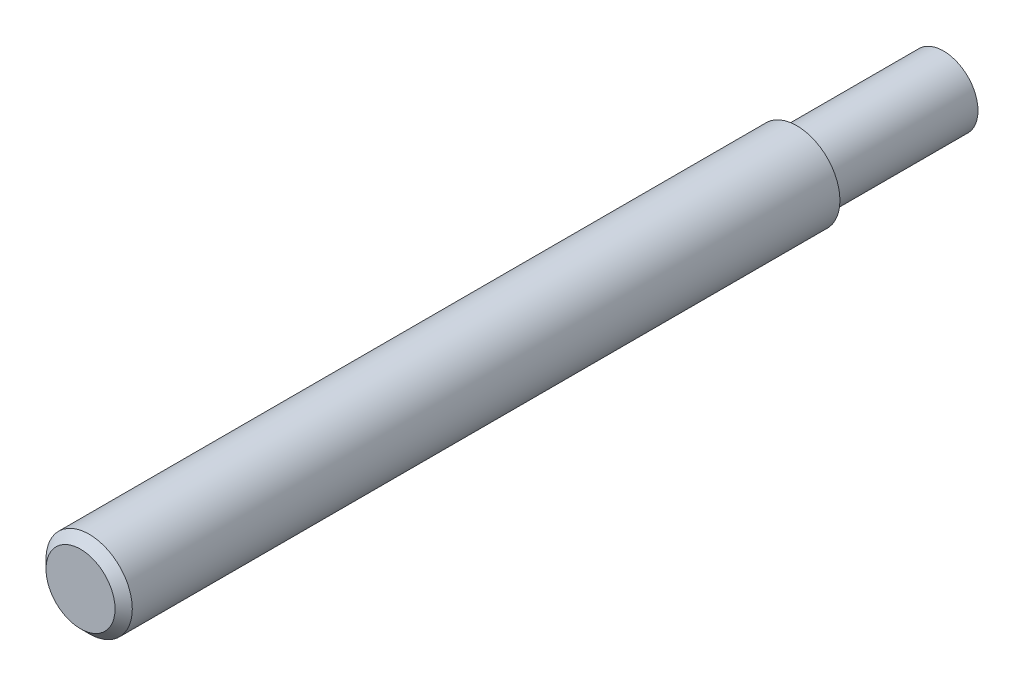
ISO-10303-21;
HEADER;
FILE_DESCRIPTION(('STEP AP214'),'2;1');
FILE_NAME('part.step','',(''),(''),'','','');
FILE_SCHEMA(('AUTOMOTIVE_DESIGN { 1 0 10303 214 1 1 1 1 }'));
ENDSEC;
DATA;
#1=APPLICATION_CONTEXT('core data for automotive mechanical design processes');
#2=APPLICATION_PROTOCOL_DEFINITION('international standard','automotive_design',2000,#1);
#3=PRODUCT_CONTEXT('',#1,'mechanical');
#4=PRODUCT('Part','Part','',(#3));
#5=PRODUCT_RELATED_PRODUCT_CATEGORY('part','',(#4));
#6=PRODUCT_DEFINITION_FORMATION('','',#4);
#7=PRODUCT_DEFINITION_CONTEXT('part definition',#1,'design');
#8=PRODUCT_DEFINITION('design','',#6,#7);
#9=PRODUCT_DEFINITION_SHAPE('','',#8);
#10=(LENGTH_UNIT() NAMED_UNIT(*) SI_UNIT(.MILLI.,.METRE.));
#11=(NAMED_UNIT(*) PLANE_ANGLE_UNIT() SI_UNIT($,.RADIAN.));
#12=(NAMED_UNIT(*) SI_UNIT($,.STERADIAN.) SOLID_ANGLE_UNIT());
#13=UNCERTAINTY_MEASURE_WITH_UNIT(LENGTH_MEASURE(1.E-05),#10,'distance_accuracy_value','');
#14=(GEOMETRIC_REPRESENTATION_CONTEXT(3) GLOBAL_UNCERTAINTY_ASSIGNED_CONTEXT((#13)) GLOBAL_UNIT_ASSIGNED_CONTEXT((#10,
#11,#12)) REPRESENTATION_CONTEXT('',''));
#15=CARTESIAN_POINT('',(0.,0.,0.));
#16=DIRECTION('',(0.,0.,1.));
#17=DIRECTION('',(1.,0.,0.));
#18=AXIS2_PLACEMENT_3D('',#15,#16,#17);
#19=CARTESIAN_POINT('',(0.,0.,17.));
#20=DIRECTION('',(0.,0.,-1.));
#21=DIRECTION('',(-1.,0.,0.));
#22=AXIS2_PLACEMENT_3D('',#19,#20,#21);
#23=CYLINDRICAL_SURFACE('',#22,4.);
#24=CARTESIAN_POINT('',(0.,0.,17.));
#25=DIRECTION('',(0.,0.,1.));
#26=DIRECTION('',(1.,0.,0.));
#27=AXIS2_PLACEMENT_3D('',#24,#25,#26);
#28=CIRCLE('',#27,4.);
#29=CARTESIAN_POINT('',(4.,0.,17.));
#30=VERTEX_POINT('',#29);
#31=EDGE_CURVE('E68',#30,#30,#28,.T.);
#32=ORIENTED_EDGE('',*,*,#31,.F.);
#33=EDGE_LOOP('',(#32));
#34=FACE_BOUND('',#33,.T.);
#35=CARTESIAN_POINT('',(0.,0.,0.));
#36=DIRECTION('',(0.,0.,1.));
#37=DIRECTION('',(1.,0.,0.));
#38=AXIS2_PLACEMENT_3D('',#35,#36,#37);
#39=CIRCLE('',#38,4.);
#40=CARTESIAN_POINT('',(4.,0.,0.));
#41=VERTEX_POINT('',#40);
#42=EDGE_CURVE('E61',#41,#41,#39,.T.);
#43=ORIENTED_EDGE('',*,*,#42,.T.);
#44=EDGE_LOOP('',(#43));
#45=FACE_BOUND('',#44,.T.);
#46=ADVANCED_FACE('F38',(#34,#45),#23,.T.);
#47=CARTESIAN_POINT('',(0.,0.,0.));
#48=DIRECTION('',(0.,0.,1.));
#49=DIRECTION('',(1.,0.,0.));
#50=AXIS2_PLACEMENT_3D('',#47,#48,#49);
#51=PLANE('',#50);
#52=CARTESIAN_POINT('',(0.,0.,0.));
#53=DIRECTION('',(0.,0.,-1.));
#54=DIRECTION('',(-1.,0.,0.));
#55=AXIS2_PLACEMENT_3D('',#52,#53,#54);
#56=CIRCLE('',#55,3.5);
#57=CARTESIAN_POINT('',(-3.5,0.,0.));
#58=VERTEX_POINT('',#57);
#59=EDGE_CURVE('E64',#58,#58,#56,.T.);
#60=ORIENTED_EDGE('',*,*,#59,.F.);
#61=EDGE_LOOP('',(#60));
#62=FACE_BOUND('',#61,.T.);
#63=ORIENTED_EDGE('',*,*,#42,.F.);
#64=EDGE_LOOP('',(#63));
#65=FACE_BOUND('',#64,.T.);
#66=ADVANCED_FACE('F87',(#62,#65),#51,.F.);
#67=CARTESIAN_POINT('',(0.,0.,100.));
#68=DIRECTION('',(0.,0.,-1.));
#69=DIRECTION('',(-1.,0.,0.));
#70=AXIS2_PLACEMENT_3D('',#67,#68,#69);
#71=CYLINDRICAL_SURFACE('',#70,5.);
#72=CARTESIAN_POINT('',(0.,0.,99.));
#73=DIRECTION('',(0.,0.,1.));
#74=DIRECTION('',(1.,0.,0.));
#75=AXIS2_PLACEMENT_3D('',#72,#73,#74);
#76=CIRCLE('',#75,5.);
#77=CARTESIAN_POINT('',(5.,0.,99.));
#78=VERTEX_POINT('',#77);
#79=EDGE_CURVE('E11',#78,#78,#76,.F.);
#80=ORIENTED_EDGE('',*,*,#79,.T.);
#81=EDGE_LOOP('',(#80));
#82=FACE_BOUND('',#81,.T.);
#83=CARTESIAN_POINT('',(0.,0.,17.));
#84=DIRECTION('',(0.,0.,1.));
#85=DIRECTION('',(1.,0.,0.));
#86=AXIS2_PLACEMENT_3D('',#83,#84,#85);
#87=CIRCLE('',#86,5.);
#88=CARTESIAN_POINT('',(5.,0.,17.));
#89=VERTEX_POINT('',#88);
#90=EDGE_CURVE('E57',#89,#89,#87,.T.);
#91=ORIENTED_EDGE('',*,*,#90,.T.);
#92=EDGE_LOOP('',(#91));
#93=FACE_BOUND('',#92,.T.);
#94=ADVANCED_FACE('F92',(#82,#93),#71,.T.);
#95=CARTESIAN_POINT('',(0.,0.,100.));
#96=DIRECTION('',(0.,0.,1.));
#97=DIRECTION('',(1.,0.,0.));
#98=AXIS2_PLACEMENT_3D('',#95,#96,#97);
#99=PLANE('',#98);
#100=CARTESIAN_POINT('',(0.,0.,100.));
#101=DIRECTION('',(0.,0.,1.));
#102=DIRECTION('',(1.,0.,0.));
#103=AXIS2_PLACEMENT_3D('',#100,#101,#102);
#104=CIRCLE('',#103,4.);
#105=CARTESIAN_POINT('',(4.,0.,100.));
#106=VERTEX_POINT('',#105);
#107=EDGE_CURVE('E45',#106,#106,#104,.T.);
#108=ORIENTED_EDGE('',*,*,#107,.T.);
#109=EDGE_LOOP('',(#108));
#110=FACE_BOUND('',#109,.T.);
#111=ADVANCED_FACE('F75',(#110),#99,.T.);
#112=CARTESIAN_POINT('',(0.,0.,17.));
#113=DIRECTION('',(0.,0.,1.));
#114=DIRECTION('',(1.,0.,0.));
#115=AXIS2_PLACEMENT_3D('',#112,#113,#114);
#116=PLANE('',#115);
#117=ORIENTED_EDGE('',*,*,#31,.T.);
#118=EDGE_LOOP('',(#117));
#119=FACE_BOUND('',#118,.T.);
#120=ORIENTED_EDGE('',*,*,#90,.F.);
#121=EDGE_LOOP('',(#120));
#122=FACE_BOUND('',#121,.T.);
#123=ADVANCED_FACE('F78',(#119,#122),#116,.F.);
#124=CARTESIAN_POINT('',(0.,0.,100.));
#125=DIRECTION('',(0.,0.,-1.));
#126=DIRECTION('',(-1.,0.,0.));
#127=AXIS2_PLACEMENT_3D('',#124,#125,#126);
#128=CONICAL_SURFACE('',#127,4.,0.785398163397446);
#129=ORIENTED_EDGE('',*,*,#79,.F.);
#130=EDGE_LOOP('',(#129));
#131=FACE_BOUND('',#130,.T.);
#132=ORIENTED_EDGE('',*,*,#107,.F.);
#133=EDGE_LOOP('',(#132));
#134=FACE_BOUND('',#133,.T.);
#135=ADVANCED_FACE('F40',(#131,#134),#128,.T.);
#136=CARTESIAN_POINT('',(0.,0.,15.));
#137=DIRECTION('',(0.,0.,-1.));
#138=DIRECTION('',(-1.,0.,0.));
#139=AXIS2_PLACEMENT_3D('',#136,#137,#138);
#140=CONICAL_SURFACE('',#139,2.49999999999999,1.02974425867665);
#141=CARTESIAN_POINT('',(0.,0.,16.5021515475689));
#142=VERTEX_POINT('',#141);
#143=VERTEX_LOOP('',#142);
#144=FACE_BOUND('',#143,.T.);
#145=CARTESIAN_POINT('',(0.,0.,15.));
#146=DIRECTION('',(0.,0.,-1.));
#147=DIRECTION('',(-1.,0.,0.));
#148=AXIS2_PLACEMENT_3D('',#145,#146,#147);
#149=CIRCLE('',#148,2.49999999999999);
#150=CARTESIAN_POINT('',(-2.49999999999999,0.,15.));
#151=VERTEX_POINT('',#150);
#152=EDGE_CURVE('E55',#151,#151,#149,.T.);
#153=ORIENTED_EDGE('',*,*,#152,.T.);
#154=EDGE_LOOP('',(#153));
#155=FACE_BOUND('',#154,.T.);
#156=ADVANCED_FACE('F48',(#144,#155),#140,.F.);
#157=CARTESIAN_POINT('',(0.,0.,0.));
#158=DIRECTION('',(0.,0.,-1.));
#159=DIRECTION('',(-1.,0.,0.));
#160=AXIS2_PLACEMENT_3D('',#157,#158,#159);
#161=CYLINDRICAL_SURFACE('',#160,2.49999999999999);
#162=ORIENTED_EDGE('',*,*,#152,.F.);
#163=EDGE_LOOP('',(#162));
#164=FACE_BOUND('',#163,.T.);
#165=CARTESIAN_POINT('',(0.,0.,0.577350269189633));
#166=DIRECTION('',(0.,0.,-1.));
#167=DIRECTION('',(-1.,0.,0.));
#168=AXIS2_PLACEMENT_3D('',#165,#166,#167);
#169=CIRCLE('',#168,2.49999999999999);
#170=CARTESIAN_POINT('',(-2.49999999999999,0.,0.577350269189633));
#171=VERTEX_POINT('',#170);
#172=EDGE_CURVE('E58',#171,#171,#169,.T.);
#173=ORIENTED_EDGE('',*,*,#172,.T.);
#174=EDGE_LOOP('',(#173));
#175=FACE_BOUND('',#174,.T.);
#176=ADVANCED_FACE('F51',(#164,#175),#161,.F.);
#177=CARTESIAN_POINT('',(0.,0.,0.));
#178=DIRECTION('',(0.,0.,-1.));
#179=DIRECTION('',(-1.,0.,0.));
#180=AXIS2_PLACEMENT_3D('',#177,#178,#179);
#181=CONICAL_SURFACE('',#180,3.5,1.04719755119659);
#182=ORIENTED_EDGE('',*,*,#172,.F.);
#183=EDGE_LOOP('',(#182));
#184=FACE_BOUND('',#183,.T.);
#185=ORIENTED_EDGE('',*,*,#59,.T.);
#186=EDGE_LOOP('',(#185));
#187=FACE_BOUND('',#186,.T.);
#188=ADVANCED_FACE('F105',(#184,#187),#181,.F.);
#189=CLOSED_SHELL('',(#46,#66,#94,#111,#123,#135,#156,#176,#188));
#190=MANIFOLD_SOLID_BREP('B2',#189);
#191=ADVANCED_BREP_SHAPE_REPRESENTATION('',(#18,#190),#14);
#192=SHAPE_DEFINITION_REPRESENTATION(#9,#191);
ENDSEC;
END-ISO-10303-21;
